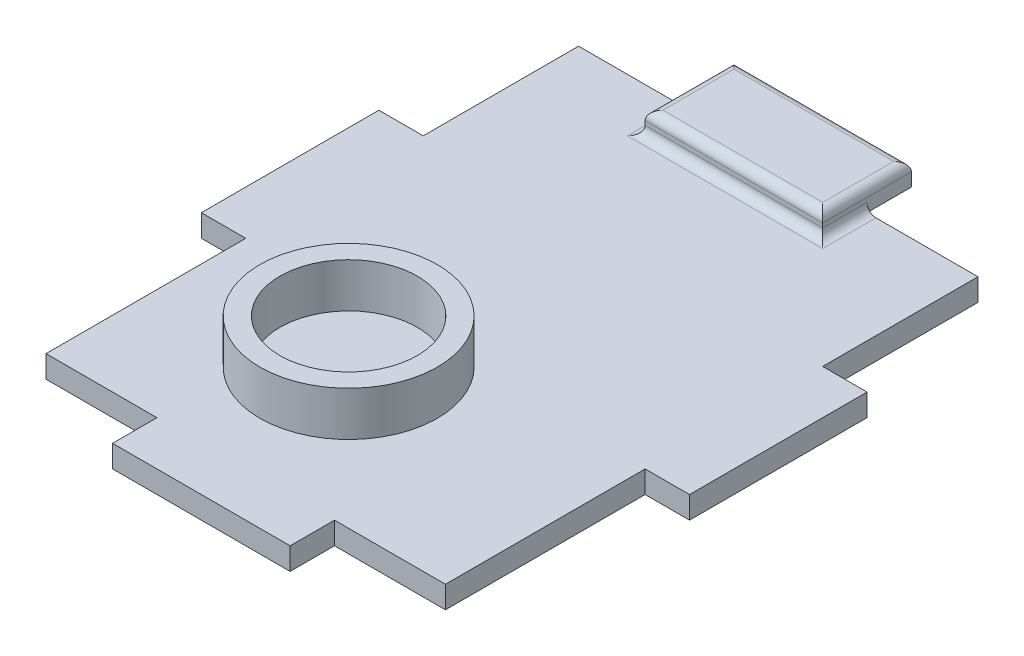
ISO-10303-21;
HEADER;
FILE_DESCRIPTION(('STEP AP214'),'2;1');
FILE_NAME('part.step','',(''),(''),'','','');
FILE_SCHEMA(('AUTOMOTIVE_DESIGN { 1 0 10303 214 1 1 1 1 }'));
ENDSEC;
DATA;
#1=APPLICATION_CONTEXT('core data for automotive mechanical design processes');
#2=APPLICATION_PROTOCOL_DEFINITION('international standard','automotive_design',2000,#1);
#3=PRODUCT_CONTEXT('',#1,'mechanical');
#4=PRODUCT('Part','Part','',(#3));
#5=PRODUCT_RELATED_PRODUCT_CATEGORY('part','',(#4));
#6=PRODUCT_DEFINITION_FORMATION('','',#4);
#7=PRODUCT_DEFINITION_CONTEXT('part definition',#1,'design');
#8=PRODUCT_DEFINITION('design','',#6,#7);
#9=PRODUCT_DEFINITION_SHAPE('','',#8);
#10=(LENGTH_UNIT() NAMED_UNIT(*) SI_UNIT(.MILLI.,.METRE.));
#11=(NAMED_UNIT(*) PLANE_ANGLE_UNIT() SI_UNIT($,.RADIAN.));
#12=(NAMED_UNIT(*) SI_UNIT($,.STERADIAN.) SOLID_ANGLE_UNIT());
#13=UNCERTAINTY_MEASURE_WITH_UNIT(LENGTH_MEASURE(1.E-05),#10,'distance_accuracy_value','');
#14=(GEOMETRIC_REPRESENTATION_CONTEXT(3) GLOBAL_UNCERTAINTY_ASSIGNED_CONTEXT((#13)) GLOBAL_UNIT_ASSIGNED_CONTEXT((#10,
#11,#12)) REPRESENTATION_CONTEXT('',''));
#15=CARTESIAN_POINT('',(0.,0.,0.));
#16=DIRECTION('',(0.,0.,1.));
#17=DIRECTION('',(1.,0.,0.));
#18=AXIS2_PLACEMENT_3D('',#15,#16,#17);
#19=CARTESIAN_POINT('',(0.,5.,0.));
#20=DIRECTION('',(0.,1.,0.));
#21=DIRECTION('',(0.,0.,1.));
#22=AXIS2_PLACEMENT_3D('',#19,#20,#21);
#23=PLANE('',#22);
#24=CARTESIAN_POINT('',(36.72,5.,-31.47));
#25=DIRECTION('',(0.,1.,0.));
#26=DIRECTION('',(0.,0.,1.));
#27=AXIS2_PLACEMENT_3D('',#24,#25,#26);
#28=CIRCLE('',#27,20.);
#29=CARTESIAN_POINT('',(36.72,5.,-11.47));
#30=VERTEX_POINT('',#29);
#31=EDGE_CURVE('E244',#30,#30,#28,.T.);
#32=ORIENTED_EDGE('',*,*,#31,.F.);
#33=EDGE_LOOP('',(#32));
#34=FACE_BOUND('',#33,.T.);
#35=DIRECTION('',(1.,0.,0.));
#36=VECTOR('',#35,1.);
#37=CARTESIAN_POINT('',(0.,5.,-108.));
#38=LINE('',#37,#36);
#39=CARTESIAN_POINT('',(67.,5.,-108.));
#40=VERTEX_POINT('',#39);
#41=CARTESIAN_POINT('',(23.,5.,-108.));
#42=VERTEX_POINT('',#41);
#43=EDGE_CURVE('E60',#40,#42,#38,.F.);
#44=ORIENTED_EDGE('',*,*,#43,.T.);
#45=DIRECTION('',(0.,0.,-1.));
#46=VECTOR('',#45,1.);
#47=CARTESIAN_POINT('',(23.,5.,0.));
#48=LINE('',#47,#46);
#49=CARTESIAN_POINT('',(23.,5.,-120.));
#50=VERTEX_POINT('',#49);
#51=EDGE_CURVE('E398',#42,#50,#48,.T.);
#52=ORIENTED_EDGE('',*,*,#51,.T.);
#53=DIRECTION('',(1.,0.,0.));
#54=VECTOR('',#53,1.);
#55=CARTESIAN_POINT('',(0.,5.,-120.));
#56=LINE('',#55,#54);
#57=CARTESIAN_POINT('',(0.,5.,-120.));
#58=VERTEX_POINT('',#57);
#59=EDGE_CURVE('E278',#58,#50,#56,.T.);
#60=ORIENTED_EDGE('',*,*,#59,.F.);
#61=DIRECTION('',(0.,0.,-1.));
#62=VECTOR('',#61,1.);
#63=CARTESIAN_POINT('',(0.,5.,0.));
#64=LINE('',#63,#62);
#65=CARTESIAN_POINT('',(0.,5.,-85.));
#66=VERTEX_POINT('',#65);
#67=EDGE_CURVE('E281',#66,#58,#64,.T.);
#68=ORIENTED_EDGE('',*,*,#67,.F.);
#69=DIRECTION('',(-1.,0.,0.));
#70=VECTOR('',#69,1.);
#71=CARTESIAN_POINT('',(1.17961196366423E-13,5.,-85.));
#72=LINE('',#71,#70);
#73=CARTESIAN_POINT('',(-9.99999999999999,5.,-85.));
#74=VERTEX_POINT('',#73);
#75=EDGE_CURVE('E286',#66,#74,#72,.T.);
#76=ORIENTED_EDGE('',*,*,#75,.T.);
#77=DIRECTION('',(0.,0.,1.));
#78=VECTOR('',#77,1.);
#79=CARTESIAN_POINT('',(-9.99999999999999,5.,0.));
#80=LINE('',#79,#78);
#81=CARTESIAN_POINT('',(-9.99999999999999,5.,-45.));
#82=VERTEX_POINT('',#81);
#83=EDGE_CURVE('E289',#74,#82,#80,.T.);
#84=ORIENTED_EDGE('',*,*,#83,.T.);
#85=DIRECTION('',(-1.,0.,0.));
#86=VECTOR('',#85,1.);
#87=CARTESIAN_POINT('',(0.,5.,-45.));
#88=LINE('',#87,#86);
#89=CARTESIAN_POINT('',(0.,5.,-45.));
#90=VERTEX_POINT('',#89);
#91=EDGE_CURVE('E291',#90,#82,#88,.T.);
#92=ORIENTED_EDGE('',*,*,#91,.F.);
#93=CARTESIAN_POINT('',(0.,5.,0.));
#94=VERTEX_POINT('',#93);
#95=EDGE_CURVE('E287',#94,#90,#64,.T.);
#96=ORIENTED_EDGE('',*,*,#95,.F.);
#97=DIRECTION('',(1.,0.,0.));
#98=VECTOR('',#97,1.);
#99=CARTESIAN_POINT('',(0.,5.,0.));
#100=LINE('',#99,#98);
#101=CARTESIAN_POINT('',(25.,5.,0.));
#102=VERTEX_POINT('',#101);
#103=EDGE_CURVE('E254',#94,#102,#100,.T.);
#104=ORIENTED_EDGE('',*,*,#103,.T.);
#105=DIRECTION('',(0.,0.,1.));
#106=VECTOR('',#105,1.);
#107=CARTESIAN_POINT('',(25.,5.,0.));
#108=LINE('',#107,#106);
#109=CARTESIAN_POINT('',(25.,5.,10.));
#110=VERTEX_POINT('',#109);
#111=EDGE_CURVE('E257',#102,#110,#108,.T.);
#112=ORIENTED_EDGE('',*,*,#111,.T.);
#113=DIRECTION('',(-1.,0.,0.));
#114=VECTOR('',#113,1.);
#115=CARTESIAN_POINT('',(0.,5.,10.));
#116=LINE('',#115,#114);
#117=CARTESIAN_POINT('',(65.,5.,10.));
#118=VERTEX_POINT('',#117);
#119=EDGE_CURVE('E261',#118,#110,#116,.T.);
#120=ORIENTED_EDGE('',*,*,#119,.F.);
#121=DIRECTION('',(0.,0.,1.));
#122=VECTOR('',#121,1.);
#123=CARTESIAN_POINT('',(65.,5.,0.));
#124=LINE('',#123,#122);
#125=CARTESIAN_POINT('',(65.,5.,0.));
#126=VERTEX_POINT('',#125);
#127=EDGE_CURVE('E264',#126,#118,#124,.T.);
#128=ORIENTED_EDGE('',*,*,#127,.F.);
#129=CARTESIAN_POINT('',(90.,5.,0.));
#130=VERTEX_POINT('',#129);
#131=EDGE_CURVE('E259',#126,#130,#100,.T.);
#132=ORIENTED_EDGE('',*,*,#131,.T.);
#133=DIRECTION('',(0.,0.,-1.));
#134=VECTOR('',#133,1.);
#135=CARTESIAN_POINT('',(90.,5.,0.));
#136=LINE('',#135,#134);
#137=CARTESIAN_POINT('',(90.,5.,-45.));
#138=VERTEX_POINT('',#137);
#139=EDGE_CURVE('E267',#130,#138,#136,.T.);
#140=ORIENTED_EDGE('',*,*,#139,.T.);
#141=DIRECTION('',(1.,0.,0.));
#142=VECTOR('',#141,1.);
#143=CARTESIAN_POINT('',(0.,5.,-45.));
#144=LINE('',#143,#142);
#145=CARTESIAN_POINT('',(100.,5.,-45.));
#146=VERTEX_POINT('',#145);
#147=EDGE_CURVE('E269',#138,#146,#144,.T.);
#148=ORIENTED_EDGE('',*,*,#147,.T.);
#149=DIRECTION('',(0.,0.,1.));
#150=VECTOR('',#149,1.);
#151=CARTESIAN_POINT('',(100.,5.,0.));
#152=LINE('',#151,#150);
#153=CARTESIAN_POINT('',(100.,5.,-85.));
#154=VERTEX_POINT('',#153);
#155=EDGE_CURVE('E272',#154,#146,#152,.T.);
#156=ORIENTED_EDGE('',*,*,#155,.F.);
#157=DIRECTION('',(1.,0.,0.));
#158=VECTOR('',#157,1.);
#159=CARTESIAN_POINT('',(1.17961196366423E-13,5.,-85.0000000000001));
#160=LINE('',#159,#158);
#161=CARTESIAN_POINT('',(90.,5.,-85.));
#162=VERTEX_POINT('',#161);
#163=EDGE_CURVE('E275',#162,#154,#160,.T.);
#164=ORIENTED_EDGE('',*,*,#163,.F.);
#165=CARTESIAN_POINT('',(90.,5.,-120.));
#166=VERTEX_POINT('',#165);
#167=EDGE_CURVE('E270',#162,#166,#136,.T.);
#168=ORIENTED_EDGE('',*,*,#167,.T.);
#169=CARTESIAN_POINT('',(67.,5.,-120.));
#170=VERTEX_POINT('',#169);
#171=EDGE_CURVE('E283',#170,#166,#56,.T.);
#172=ORIENTED_EDGE('',*,*,#171,.F.);
#173=DIRECTION('',(0.,0.,-1.));
#174=VECTOR('',#173,1.);
#175=CARTESIAN_POINT('',(67.,5.,0.));
#176=LINE('',#175,#174);
#177=EDGE_CURVE('E396',#170,#40,#176,.F.);
#178=ORIENTED_EDGE('',*,*,#177,.T.);
#179=EDGE_LOOP('',(#44,#52,#60,#68,#76,#84,#92,#96,#104,#112,#120,#128,#132,#140,#148,#156,#164,
#168,#172,#178));
#180=FACE_BOUND('',#179,.T.);
#181=ADVANCED_FACE('F35',(#34,#180),#23,.T.);
#182=CARTESIAN_POINT('',(0.,5.,0.));
#183=DIRECTION('',(0.,0.,-1.));
#184=DIRECTION('',(-1.,0.,0.));
#185=AXIS2_PLACEMENT_3D('',#182,#183,#184);
#186=PLANE('',#185);
#187=DIRECTION('',(1.,0.,0.));
#188=VECTOR('',#187,1.);
#189=CARTESIAN_POINT('',(0.,0.,0.));
#190=LINE('',#189,#188);
#191=CARTESIAN_POINT('',(0.,0.,0.));
#192=VERTEX_POINT('',#191);
#193=CARTESIAN_POINT('',(25.,0.,0.));
#194=VERTEX_POINT('',#193);
#195=EDGE_CURVE('E251',#192,#194,#190,.T.);
#196=ORIENTED_EDGE('',*,*,#195,.T.);
#197=DIRECTION('',(0.,-1.,0.));
#198=VECTOR('',#197,1.);
#199=CARTESIAN_POINT('',(25.,5.,0.));
#200=LINE('',#199,#198);
#201=EDGE_CURVE('E365',#102,#194,#200,.T.);
#202=ORIENTED_EDGE('',*,*,#201,.F.);
#203=ORIENTED_EDGE('',*,*,#103,.F.);
#204=DIRECTION('',(0.,-1.,0.));
#205=VECTOR('',#204,1.);
#206=CARTESIAN_POINT('',(0.,5.,0.));
#207=LINE('',#206,#205);
#208=EDGE_CURVE('E332',#94,#192,#207,.T.);
#209=ORIENTED_EDGE('',*,*,#208,.T.);
#210=EDGE_LOOP('',(#196,#202,#203,#209));
#211=FACE_BOUND('',#210,.T.);
#212=ADVANCED_FACE('F460',(#211),#186,.F.);
#213=CARTESIAN_POINT('',(25.,5.,0.));
#214=DIRECTION('',(1.,0.,0.));
#215=DIRECTION('',(0.,0.,-1.));
#216=AXIS2_PLACEMENT_3D('',#213,#214,#215);
#217=PLANE('',#216);
#218=DIRECTION('',(0.,0.,1.));
#219=VECTOR('',#218,1.);
#220=CARTESIAN_POINT('',(25.,0.,0.));
#221=LINE('',#220,#219);
#222=CARTESIAN_POINT('',(25.,0.,10.));
#223=VERTEX_POINT('',#222);
#224=EDGE_CURVE('E296',#194,#223,#221,.T.);
#225=ORIENTED_EDGE('',*,*,#224,.T.);
#226=DIRECTION('',(0.,-1.,0.));
#227=VECTOR('',#226,1.);
#228=CARTESIAN_POINT('',(25.,5.,10.));
#229=LINE('',#228,#227);
#230=EDGE_CURVE('E363',#110,#223,#229,.T.);
#231=ORIENTED_EDGE('',*,*,#230,.F.);
#232=ORIENTED_EDGE('',*,*,#111,.F.);
#233=ORIENTED_EDGE('',*,*,#201,.T.);
#234=EDGE_LOOP('',(#225,#231,#232,#233));
#235=FACE_BOUND('',#234,.T.);
#236=ADVANCED_FACE('F467',(#235),#217,.F.);
#237=CARTESIAN_POINT('',(0.,5.,10.));
#238=DIRECTION('',(0.,0.,1.));
#239=DIRECTION('',(1.,0.,0.));
#240=AXIS2_PLACEMENT_3D('',#237,#238,#239);
#241=PLANE('',#240);
#242=DIRECTION('',(-1.,0.,0.));
#243=VECTOR('',#242,1.);
#244=CARTESIAN_POINT('',(0.,0.,10.));
#245=LINE('',#244,#243);
#246=CARTESIAN_POINT('',(65.,0.,10.));
#247=VERTEX_POINT('',#246);
#248=EDGE_CURVE('E300',#247,#223,#245,.T.);
#249=ORIENTED_EDGE('',*,*,#248,.F.);
#250=DIRECTION('',(0.,-1.,0.));
#251=VECTOR('',#250,1.);
#252=CARTESIAN_POINT('',(65.,5.,10.));
#253=LINE('',#252,#251);
#254=EDGE_CURVE('E361',#118,#247,#253,.T.);
#255=ORIENTED_EDGE('',*,*,#254,.F.);
#256=ORIENTED_EDGE('',*,*,#119,.T.);
#257=ORIENTED_EDGE('',*,*,#230,.T.);
#258=EDGE_LOOP('',(#249,#255,#256,#257));
#259=FACE_BOUND('',#258,.T.);
#260=ADVANCED_FACE('F737',(#259),#241,.T.);
#261=CARTESIAN_POINT('',(65.,5.,0.));
#262=DIRECTION('',(1.,0.,0.));
#263=DIRECTION('',(0.,0.,-1.));
#264=AXIS2_PLACEMENT_3D('',#261,#262,#263);
#265=PLANE('',#264);
#266=DIRECTION('',(0.,0.,1.));
#267=VECTOR('',#266,1.);
#268=CARTESIAN_POINT('',(65.,0.,0.));
#269=LINE('',#268,#267);
#270=CARTESIAN_POINT('',(65.,0.,0.));
#271=VERTEX_POINT('',#270);
#272=EDGE_CURVE('E303',#271,#247,#269,.T.);
#273=ORIENTED_EDGE('',*,*,#272,.F.);
#274=DIRECTION('',(0.,-1.,0.));
#275=VECTOR('',#274,1.);
#276=CARTESIAN_POINT('',(65.,5.,0.));
#277=LINE('',#276,#275);
#278=EDGE_CURVE('E359',#126,#271,#277,.T.);
#279=ORIENTED_EDGE('',*,*,#278,.F.);
#280=ORIENTED_EDGE('',*,*,#127,.T.);
#281=ORIENTED_EDGE('',*,*,#254,.T.);
#282=EDGE_LOOP('',(#273,#279,#280,#281));
#283=FACE_BOUND('',#282,.T.);
#284=ADVANCED_FACE('F733',(#283),#265,.T.);
#285=CARTESIAN_POINT('',(90.,0.,0.));
#286=VERTEX_POINT('',#285);
#287=EDGE_CURVE('E297',#271,#286,#190,.T.);
#288=ORIENTED_EDGE('',*,*,#287,.T.);
#289=DIRECTION('',(0.,-1.,0.));
#290=VECTOR('',#289,1.);
#291=CARTESIAN_POINT('',(90.,5.,0.));
#292=LINE('',#291,#290);
#293=EDGE_CURVE('E356',#130,#286,#292,.T.);
#294=ORIENTED_EDGE('',*,*,#293,.F.);
#295=ORIENTED_EDGE('',*,*,#131,.F.);
#296=ORIENTED_EDGE('',*,*,#278,.T.);
#297=EDGE_LOOP('',(#288,#294,#295,#296));
#298=FACE_BOUND('',#297,.T.);
#299=ADVANCED_FACE('F470',(#298),#186,.F.);
#300=CARTESIAN_POINT('',(90.,5.,0.));
#301=DIRECTION('',(-1.,0.,0.));
#302=DIRECTION('',(0.,0.,1.));
#303=AXIS2_PLACEMENT_3D('',#300,#301,#302);
#304=PLANE('',#303);
#305=DIRECTION('',(0.,0.,-1.));
#306=VECTOR('',#305,1.);
#307=CARTESIAN_POINT('',(90.,0.,0.));
#308=LINE('',#307,#306);
#309=CARTESIAN_POINT('',(90.,0.,-45.));
#310=VERTEX_POINT('',#309);
#311=EDGE_CURVE('E306',#286,#310,#308,.T.);
#312=ORIENTED_EDGE('',*,*,#311,.T.);
#313=DIRECTION('',(0.,-1.,0.));
#314=VECTOR('',#313,1.);
#315=CARTESIAN_POINT('',(90.,5.,-45.));
#316=LINE('',#315,#314);
#317=EDGE_CURVE('E353',#138,#310,#316,.T.);
#318=ORIENTED_EDGE('',*,*,#317,.F.);
#319=ORIENTED_EDGE('',*,*,#139,.F.);
#320=ORIENTED_EDGE('',*,*,#293,.T.);
#321=EDGE_LOOP('',(#312,#318,#319,#320));
#322=FACE_BOUND('',#321,.T.);
#323=ADVANCED_FACE('F721',(#322),#304,.F.);
#324=CARTESIAN_POINT('',(0.,5.,-45.));
#325=DIRECTION('',(0.,0.,-1.));
#326=DIRECTION('',(-1.,0.,0.));
#327=AXIS2_PLACEMENT_3D('',#324,#325,#326);
#328=PLANE('',#327);
#329=DIRECTION('',(1.,0.,0.));
#330=VECTOR('',#329,1.);
#331=CARTESIAN_POINT('',(0.,0.,-45.));
#332=LINE('',#331,#330);
#333=CARTESIAN_POINT('',(100.,0.,-45.));
#334=VERTEX_POINT('',#333);
#335=EDGE_CURVE('E308',#310,#334,#332,.T.);
#336=ORIENTED_EDGE('',*,*,#335,.T.);
#337=DIRECTION('',(0.,-1.,0.));
#338=VECTOR('',#337,1.);
#339=CARTESIAN_POINT('',(100.,5.,-45.));
#340=LINE('',#339,#338);
#341=EDGE_CURVE('E351',#146,#334,#340,.T.);
#342=ORIENTED_EDGE('',*,*,#341,.F.);
#343=ORIENTED_EDGE('',*,*,#147,.F.);
#344=ORIENTED_EDGE('',*,*,#317,.T.);
#345=EDGE_LOOP('',(#336,#342,#343,#344));
#346=FACE_BOUND('',#345,.T.);
#347=ADVANCED_FACE('F727',(#346),#328,.F.);
#348=CARTESIAN_POINT('',(100.,5.,0.));
#349=DIRECTION('',(1.,0.,0.));
#350=DIRECTION('',(0.,0.,-1.));
#351=AXIS2_PLACEMENT_3D('',#348,#349,#350);
#352=PLANE('',#351);
#353=DIRECTION('',(0.,0.,1.));
#354=VECTOR('',#353,1.);
#355=CARTESIAN_POINT('',(100.,0.,0.));
#356=LINE('',#355,#354);
#357=CARTESIAN_POINT('',(100.,0.,-85.));
#358=VERTEX_POINT('',#357);
#359=EDGE_CURVE('E312',#358,#334,#356,.T.);
#360=ORIENTED_EDGE('',*,*,#359,.F.);
#361=DIRECTION('',(0.,-1.,0.));
#362=VECTOR('',#361,1.);
#363=CARTESIAN_POINT('',(100.,5.,-85.));
#364=LINE('',#363,#362);
#365=EDGE_CURVE('E349',#154,#358,#364,.T.);
#366=ORIENTED_EDGE('',*,*,#365,.F.);
#367=ORIENTED_EDGE('',*,*,#155,.T.);
#368=ORIENTED_EDGE('',*,*,#341,.T.);
#369=EDGE_LOOP('',(#360,#366,#367,#368));
#370=FACE_BOUND('',#369,.T.);
#371=ADVANCED_FACE('F723',(#370),#352,.T.);
#372=CARTESIAN_POINT('',(1.17961196366423E-13,5.,-85.0000000000001));
#373=DIRECTION('',(0.,0.,-1.));
#374=DIRECTION('',(-1.,0.,0.));
#375=AXIS2_PLACEMENT_3D('',#372,#373,#374);
#376=PLANE('',#375);
#377=DIRECTION('',(1.,0.,0.));
#378=VECTOR('',#377,1.);
#379=CARTESIAN_POINT('',(1.17961196366423E-13,0.,-85.0000000000001));
#380=LINE('',#379,#378);
#381=CARTESIAN_POINT('',(90.,0.,-85.));
#382=VERTEX_POINT('',#381);
#383=EDGE_CURVE('E315',#382,#358,#380,.T.);
#384=ORIENTED_EDGE('',*,*,#383,.F.);
#385=DIRECTION('',(0.,-1.,0.));
#386=VECTOR('',#385,1.);
#387=CARTESIAN_POINT('',(90.,5.,-85.));
#388=LINE('',#387,#386);
#389=EDGE_CURVE('E347',#162,#382,#388,.T.);
#390=ORIENTED_EDGE('',*,*,#389,.F.);
#391=ORIENTED_EDGE('',*,*,#163,.T.);
#392=ORIENTED_EDGE('',*,*,#365,.T.);
#393=EDGE_LOOP('',(#384,#390,#391,#392));
#394=FACE_BOUND('',#393,.T.);
#395=ADVANCED_FACE('F719',(#394),#376,.T.);
#396=CARTESIAN_POINT('',(90.,0.,-120.));
#397=VERTEX_POINT('',#396);
#398=EDGE_CURVE('E309',#382,#397,#308,.T.);
#399=ORIENTED_EDGE('',*,*,#398,.T.);
#400=DIRECTION('',(0.,-1.,0.));
#401=VECTOR('',#400,1.);
#402=CARTESIAN_POINT('',(90.,5.,-120.));
#403=LINE('',#402,#401);
#404=EDGE_CURVE('E345',#166,#397,#403,.T.);
#405=ORIENTED_EDGE('',*,*,#404,.F.);
#406=ORIENTED_EDGE('',*,*,#167,.F.);
#407=ORIENTED_EDGE('',*,*,#389,.T.);
#408=EDGE_LOOP('',(#399,#405,#406,#407));
#409=FACE_BOUND('',#408,.T.);
#410=ADVANCED_FACE('F604',(#409),#304,.F.);
#411=CARTESIAN_POINT('',(0.,5.,-120.));
#412=DIRECTION('',(0.,0.,-1.));
#413=DIRECTION('',(-1.,0.,0.));
#414=AXIS2_PLACEMENT_3D('',#411,#412,#413);
#415=PLANE('',#414);
#416=DIRECTION('',(1.,0.,0.));
#417=VECTOR('',#416,1.);
#418=CARTESIAN_POINT('',(0.,0.,-120.));
#419=LINE('',#418,#417);
#420=CARTESIAN_POINT('',(0.,0.,-120.));
#421=VERTEX_POINT('',#420);
#422=EDGE_CURVE('E318',#421,#397,#419,.T.);
#423=ORIENTED_EDGE('',*,*,#422,.F.);
#424=DIRECTION('',(0.,-1.,0.));
#425=VECTOR('',#424,1.);
#426=CARTESIAN_POINT('',(0.,5.,-120.));
#427=LINE('',#426,#425);
#428=EDGE_CURVE('E343',#58,#421,#427,.T.);
#429=ORIENTED_EDGE('',*,*,#428,.F.);
#430=ORIENTED_EDGE('',*,*,#59,.T.);
#431=CARTESIAN_POINT('',(23.,7.,-120.));
#432=DIRECTION('',(0.,0.,-1.));
#433=DIRECTION('',(-1.,0.,0.));
#434=AXIS2_PLACEMENT_3D('',#431,#432,#433);
#435=CIRCLE('',#434,2.);
#436=CARTESIAN_POINT('',(25.,7.,-120.));
#437=VERTEX_POINT('',#436);
#438=EDGE_CURVE('E44',#50,#437,#435,.F.);
#439=ORIENTED_EDGE('',*,*,#438,.T.);
#440=DIRECTION('',(0.,1.,0.));
#441=VECTOR('',#440,1.);
#442=CARTESIAN_POINT('',(25.,10.,-120.));
#443=LINE('',#442,#441);
#444=CARTESIAN_POINT('',(25.,5.,-120.));
#445=VERTEX_POINT('',#444);
#446=EDGE_CURVE('E52',#445,#437,#443,.T.);
#447=ORIENTED_EDGE('',*,*,#446,.F.);
#448=CARTESIAN_POINT('',(65.,5.,-120.));
#449=VERTEX_POINT('',#448);
#450=EDGE_CURVE('E282',#445,#449,#56,.T.);
#451=ORIENTED_EDGE('',*,*,#450,.T.);
#452=DIRECTION('',(0.,-1.,0.));
#453=VECTOR('',#452,1.);
#454=CARTESIAN_POINT('',(65.,10.,-120.));
#455=LINE('',#454,#453);
#456=CARTESIAN_POINT('',(65.,7.,-120.));
#457=VERTEX_POINT('',#456);
#458=EDGE_CURVE('E229',#457,#449,#455,.T.);
#459=ORIENTED_EDGE('',*,*,#458,.F.);
#460=CARTESIAN_POINT('',(67.,7.,-120.));
#461=DIRECTION('',(0.,0.,-1.));
#462=DIRECTION('',(-1.,0.,0.));
#463=AXIS2_PLACEMENT_3D('',#460,#461,#462);
#464=CIRCLE('',#463,2.);
#465=EDGE_CURVE('E11',#457,#170,#464,.F.);
#466=ORIENTED_EDGE('',*,*,#465,.T.);
#467=ORIENTED_EDGE('',*,*,#171,.T.);
#468=ORIENTED_EDGE('',*,*,#404,.T.);
#469=EDGE_LOOP('',(#423,#429,#430,#439,#447,#451,#459,#466,#467,#468));
#470=FACE_BOUND('',#469,.T.);
#471=ADVANCED_FACE('F599',(#470),#415,.T.);
#472=CARTESIAN_POINT('',(0.,5.,0.));
#473=DIRECTION('',(-1.,0.,0.));
#474=DIRECTION('',(0.,0.,1.));
#475=AXIS2_PLACEMENT_3D('',#472,#473,#474);
#476=PLANE('',#475);
#477=DIRECTION('',(0.,0.,-1.));
#478=VECTOR('',#477,1.);
#479=CARTESIAN_POINT('',(0.,0.,0.));
#480=LINE('',#479,#478);
#481=CARTESIAN_POINT('',(0.,0.,-85.));
#482=VERTEX_POINT('',#481);
#483=EDGE_CURVE('E321',#482,#421,#480,.T.);
#484=ORIENTED_EDGE('',*,*,#483,.F.);
#485=DIRECTION('',(0.,-1.,0.));
#486=VECTOR('',#485,1.);
#487=CARTESIAN_POINT('',(0.,5.,-85.));
#488=LINE('',#487,#486);
#489=EDGE_CURVE('E341',#66,#482,#488,.T.);
#490=ORIENTED_EDGE('',*,*,#489,.F.);
#491=ORIENTED_EDGE('',*,*,#67,.T.);
#492=ORIENTED_EDGE('',*,*,#428,.T.);
#493=EDGE_LOOP('',(#484,#490,#491,#492));
#494=FACE_BOUND('',#493,.T.);
#495=ADVANCED_FACE('F603',(#494),#476,.T.);
#496=CARTESIAN_POINT('',(1.17961196366423E-13,5.,-85.));
#497=DIRECTION('',(0.,0.,1.));
#498=DIRECTION('',(1.,0.,0.));
#499=AXIS2_PLACEMENT_3D('',#496,#497,#498);
#500=PLANE('',#499);
#501=DIRECTION('',(-1.,0.,0.));
#502=VECTOR('',#501,1.);
#503=CARTESIAN_POINT('',(1.17961196366423E-13,0.,-85.));
#504=LINE('',#503,#502);
#505=CARTESIAN_POINT('',(-9.99999999999999,0.,-85.));
#506=VERTEX_POINT('',#505);
#507=EDGE_CURVE('E324',#482,#506,#504,.T.);
#508=ORIENTED_EDGE('',*,*,#507,.T.);
#509=DIRECTION('',(0.,-1.,0.));
#510=VECTOR('',#509,1.);
#511=CARTESIAN_POINT('',(-9.99999999999999,5.,-85.));
#512=LINE('',#511,#510);
#513=EDGE_CURVE('E338',#74,#506,#512,.T.);
#514=ORIENTED_EDGE('',*,*,#513,.F.);
#515=ORIENTED_EDGE('',*,*,#75,.F.);
#516=ORIENTED_EDGE('',*,*,#489,.T.);
#517=EDGE_LOOP('',(#508,#514,#515,#516));
#518=FACE_BOUND('',#517,.T.);
#519=ADVANCED_FACE('F619',(#518),#500,.F.);
#520=CARTESIAN_POINT('',(-9.99999999999999,5.,0.));
#521=DIRECTION('',(1.,0.,0.));
#522=DIRECTION('',(0.,0.,-1.));
#523=AXIS2_PLACEMENT_3D('',#520,#521,#522);
#524=PLANE('',#523);
#525=DIRECTION('',(0.,0.,1.));
#526=VECTOR('',#525,1.);
#527=CARTESIAN_POINT('',(-9.99999999999999,0.,0.));
#528=LINE('',#527,#526);
#529=CARTESIAN_POINT('',(-9.99999999999999,0.,-45.));
#530=VERTEX_POINT('',#529);
#531=EDGE_CURVE('E326',#506,#530,#528,.T.);
#532=ORIENTED_EDGE('',*,*,#531,.T.);
#533=DIRECTION('',(0.,-1.,0.));
#534=VECTOR('',#533,1.);
#535=CARTESIAN_POINT('',(-9.99999999999999,5.,-45.));
#536=LINE('',#535,#534);
#537=EDGE_CURVE('E336',#82,#530,#536,.T.);
#538=ORIENTED_EDGE('',*,*,#537,.F.);
#539=ORIENTED_EDGE('',*,*,#83,.F.);
#540=ORIENTED_EDGE('',*,*,#513,.T.);
#541=EDGE_LOOP('',(#532,#538,#539,#540));
#542=FACE_BOUND('',#541,.T.);
#543=ADVANCED_FACE('F627',(#542),#524,.F.);
#544=CARTESIAN_POINT('',(0.,5.,-45.));
#545=DIRECTION('',(0.,0.,1.));
#546=DIRECTION('',(1.,0.,0.));
#547=AXIS2_PLACEMENT_3D('',#544,#545,#546);
#548=PLANE('',#547);
#549=DIRECTION('',(-1.,0.,0.));
#550=VECTOR('',#549,1.);
#551=CARTESIAN_POINT('',(0.,0.,-45.));
#552=LINE('',#551,#550);
#553=CARTESIAN_POINT('',(0.,0.,-45.));
#554=VERTEX_POINT('',#553);
#555=EDGE_CURVE('E329',#554,#530,#552,.T.);
#556=ORIENTED_EDGE('',*,*,#555,.F.);
#557=DIRECTION('',(0.,-1.,0.));
#558=VECTOR('',#557,1.);
#559=CARTESIAN_POINT('',(0.,5.,-45.));
#560=LINE('',#559,#558);
#561=EDGE_CURVE('E334',#90,#554,#560,.T.);
#562=ORIENTED_EDGE('',*,*,#561,.F.);
#563=ORIENTED_EDGE('',*,*,#91,.T.);
#564=ORIENTED_EDGE('',*,*,#537,.T.);
#565=EDGE_LOOP('',(#556,#562,#563,#564));
#566=FACE_BOUND('',#565,.T.);
#567=ADVANCED_FACE('F635',(#566),#548,.T.);
#568=EDGE_CURVE('E258',#192,#554,#480,.T.);
#569=ORIENTED_EDGE('',*,*,#568,.F.);
#570=ORIENTED_EDGE('',*,*,#208,.F.);
#571=ORIENTED_EDGE('',*,*,#95,.T.);
#572=ORIENTED_EDGE('',*,*,#561,.T.);
#573=EDGE_LOOP('',(#569,#570,#571,#572));
#574=FACE_BOUND('',#573,.T.);
#575=ADVANCED_FACE('F497',(#574),#476,.T.);
#576=CARTESIAN_POINT('',(0.,0.,0.));
#577=DIRECTION('',(0.,1.,0.));
#578=DIRECTION('',(0.,0.,1.));
#579=AXIS2_PLACEMENT_3D('',#576,#577,#578);
#580=PLANE('',#579);
#581=ORIENTED_EDGE('',*,*,#195,.F.);
#582=ORIENTED_EDGE('',*,*,#568,.T.);
#583=ORIENTED_EDGE('',*,*,#555,.T.);
#584=ORIENTED_EDGE('',*,*,#531,.F.);
#585=ORIENTED_EDGE('',*,*,#507,.F.);
#586=ORIENTED_EDGE('',*,*,#483,.T.);
#587=ORIENTED_EDGE('',*,*,#422,.T.);
#588=ORIENTED_EDGE('',*,*,#398,.F.);
#589=ORIENTED_EDGE('',*,*,#383,.T.);
#590=ORIENTED_EDGE('',*,*,#359,.T.);
#591=ORIENTED_EDGE('',*,*,#335,.F.);
#592=ORIENTED_EDGE('',*,*,#311,.F.);
#593=ORIENTED_EDGE('',*,*,#287,.F.);
#594=ORIENTED_EDGE('',*,*,#272,.T.);
#595=ORIENTED_EDGE('',*,*,#248,.T.);
#596=ORIENTED_EDGE('',*,*,#224,.F.);
#597=EDGE_LOOP('',(#581,#582,#583,#584,#585,#586,#587,#588,#589,#590,#591,#592,#593,#594,#595,#596));
#598=FACE_BOUND('',#597,.T.);
#599=ADVANCED_FACE('F489',(#598),#580,.F.);
#600=CARTESIAN_POINT('',(36.72,15.,-31.47));
#601=DIRECTION('',(0.,-1.,0.));
#602=DIRECTION('',(0.,0.,-1.));
#603=AXIS2_PLACEMENT_3D('',#600,#601,#602);
#604=CYLINDRICAL_SURFACE('',#603,15.5);
#605=CARTESIAN_POINT('',(36.72,15.,-31.47));
#606=DIRECTION('',(0.,1.,0.));
#607=DIRECTION('',(0.,0.,1.));
#608=AXIS2_PLACEMENT_3D('',#605,#606,#607);
#609=CIRCLE('',#608,15.5);
#610=CARTESIAN_POINT('',(36.72,15.,-15.97));
#611=VERTEX_POINT('',#610);
#612=EDGE_CURVE('E245',#611,#611,#609,.T.);
#613=ORIENTED_EDGE('',*,*,#612,.T.);
#614=EDGE_LOOP('',(#613));
#615=FACE_BOUND('',#614,.T.);
#616=CARTESIAN_POINT('',(36.72,5.,-31.47));
#617=DIRECTION('',(0.,1.,0.));
#618=DIRECTION('',(0.,0.,1.));
#619=AXIS2_PLACEMENT_3D('',#616,#617,#618);
#620=CIRCLE('',#619,15.5);
#621=CARTESIAN_POINT('',(36.72,5.,-15.97));
#622=VERTEX_POINT('',#621);
#623=EDGE_CURVE('E368',#622,#622,#620,.F.);
#624=ORIENTED_EDGE('',*,*,#623,.T.);
#625=EDGE_LOOP('',(#624));
#626=FACE_BOUND('',#625,.T.);
#627=ADVANCED_FACE('F487',(#615,#626),#604,.F.);
#628=CARTESIAN_POINT('',(36.72,15.,-31.47));
#629=DIRECTION('',(0.,-1.,0.));
#630=DIRECTION('',(0.,0.,-1.));
#631=AXIS2_PLACEMENT_3D('',#628,#629,#630);
#632=CYLINDRICAL_SURFACE('',#631,20.);
#633=CARTESIAN_POINT('',(36.72,15.,-31.47));
#634=DIRECTION('',(0.,1.,0.));
#635=DIRECTION('',(0.,0.,1.));
#636=AXIS2_PLACEMENT_3D('',#633,#634,#635);
#637=CIRCLE('',#636,20.);
#638=CARTESIAN_POINT('',(36.72,15.,-11.47));
#639=VERTEX_POINT('',#638);
#640=EDGE_CURVE('E248',#639,#639,#637,.T.);
#641=ORIENTED_EDGE('',*,*,#640,.F.);
#642=EDGE_LOOP('',(#641));
#643=FACE_BOUND('',#642,.T.);
#644=ORIENTED_EDGE('',*,*,#31,.T.);
#645=EDGE_LOOP('',(#644));
#646=FACE_BOUND('',#645,.T.);
#647=ADVANCED_FACE('F482',(#643,#646),#632,.T.);
#648=CARTESIAN_POINT('',(0.,15.,0.));
#649=DIRECTION('',(0.,1.,0.));
#650=DIRECTION('',(0.,0.,1.));
#651=AXIS2_PLACEMENT_3D('',#648,#649,#650);
#652=PLANE('',#651);
#653=ORIENTED_EDGE('',*,*,#612,.F.);
#654=EDGE_LOOP('',(#653));
#655=FACE_BOUND('',#654,.T.);
#656=ORIENTED_EDGE('',*,*,#640,.T.);
#657=EDGE_LOOP('',(#656));
#658=FACE_BOUND('',#657,.T.);
#659=ADVANCED_FACE('F475',(#655,#658),#652,.T.);
#660=ORIENTED_EDGE('',*,*,#623,.F.);
#661=EDGE_LOOP('',(#660));
#662=FACE_BOUND('',#661,.T.);
#663=ADVANCED_FACE('F463',(#662),#23,.T.);
#664=CARTESIAN_POINT('',(25.,10.,-130.));
#665=DIRECTION('',(1.,0.,0.));
#666=DIRECTION('',(0.,0.,-1.));
#667=AXIS2_PLACEMENT_3D('',#664,#665,#666);
#668=PLANE('',#667);
#669=DIRECTION('',(0.,-1.,0.));
#670=VECTOR('',#669,1.);
#671=CARTESIAN_POINT('',(25.,10.,-110.));
#672=LINE('',#671,#670);
#673=CARTESIAN_POINT('',(25.,8.,-110.));
#674=VERTEX_POINT('',#673);
#675=CARTESIAN_POINT('',(25.,7.,-110.));
#676=VERTEX_POINT('',#675);
#677=EDGE_CURVE('E241',#674,#676,#672,.T.);
#678=ORIENTED_EDGE('',*,*,#677,.F.);
#679=DIRECTION('',(0.,0.,1.));
#680=VECTOR('',#679,1.);
#681=CARTESIAN_POINT('',(25.,8.,-130.));
#682=LINE('',#681,#680);
#683=CARTESIAN_POINT('',(25.,8.,-130.));
#684=VERTEX_POINT('',#683);
#685=EDGE_CURVE('E393',#674,#684,#682,.F.);
#686=ORIENTED_EDGE('',*,*,#685,.T.);
#687=DIRECTION('',(0.,-1.,0.));
#688=VECTOR('',#687,1.);
#689=CARTESIAN_POINT('',(25.,10.,-130.));
#690=LINE('',#689,#688);
#691=CARTESIAN_POINT('',(25.,5.,-130.));
#692=VERTEX_POINT('',#691);
#693=EDGE_CURVE('E223',#684,#692,#690,.T.);
#694=ORIENTED_EDGE('',*,*,#693,.T.);
#695=DIRECTION('',(0.,0.,1.));
#696=VECTOR('',#695,1.);
#697=CARTESIAN_POINT('',(25.,5.,-130.));
#698=LINE('',#697,#696);
#699=EDGE_CURVE('E232',#692,#445,#698,.T.);
#700=ORIENTED_EDGE('',*,*,#699,.T.);
#701=ORIENTED_EDGE('',*,*,#446,.T.);
#702=DIRECTION('',(0.,0.,-1.));
#703=VECTOR('',#702,1.);
#704=CARTESIAN_POINT('',(25.,7.,-130.));
#705=LINE('',#704,#703);
#706=EDGE_CURVE('E390',#437,#676,#705,.F.);
#707=ORIENTED_EDGE('',*,*,#706,.T.);
#708=EDGE_LOOP('',(#678,#686,#694,#700,#701,#707));
#709=FACE_BOUND('',#708,.T.);
#710=ADVANCED_FACE('F448',(#709),#668,.F.);
#711=CARTESIAN_POINT('',(65.,10.,-110.));
#712=DIRECTION('',(0.,0.,-1.));
#713=DIRECTION('',(-1.,0.,0.));
#714=AXIS2_PLACEMENT_3D('',#711,#712,#713);
#715=PLANE('',#714);
#716=DIRECTION('',(0.,-1.,0.));
#717=VECTOR('',#716,1.);
#718=CARTESIAN_POINT('',(65.,10.,-110.));
#719=LINE('',#718,#717);
#720=CARTESIAN_POINT('',(65.,8.,-110.));
#721=VERTEX_POINT('',#720);
#722=CARTESIAN_POINT('',(65.,7.,-110.));
#723=VERTEX_POINT('',#722);
#724=EDGE_CURVE('E222',#721,#723,#719,.T.);
#725=ORIENTED_EDGE('',*,*,#724,.F.);
#726=DIRECTION('',(1.,0.,0.));
#727=VECTOR('',#726,1.);
#728=CARTESIAN_POINT('',(65.,8.,-110.));
#729=LINE('',#728,#727);
#730=EDGE_CURVE('E388',#721,#674,#729,.F.);
#731=ORIENTED_EDGE('',*,*,#730,.T.);
#732=ORIENTED_EDGE('',*,*,#677,.T.);
#733=DIRECTION('',(1.,0.,0.));
#734=VECTOR('',#733,1.);
#735=CARTESIAN_POINT('',(65.,7.,-110.));
#736=LINE('',#735,#734);
#737=EDGE_CURVE('E386',#676,#723,#736,.T.);
#738=ORIENTED_EDGE('',*,*,#737,.T.);
#739=EDGE_LOOP('',(#725,#731,#732,#738));
#740=FACE_BOUND('',#739,.T.);
#741=ADVANCED_FACE('F428',(#740),#715,.F.);
#742=CARTESIAN_POINT('',(65.,10.,-130.));
#743=DIRECTION('',(-1.,0.,0.));
#744=DIRECTION('',(0.,0.,1.));
#745=AXIS2_PLACEMENT_3D('',#742,#743,#744);
#746=PLANE('',#745);
#747=DIRECTION('',(0.,-1.,0.));
#748=VECTOR('',#747,1.);
#749=CARTESIAN_POINT('',(65.,10.,-130.));
#750=LINE('',#749,#748);
#751=CARTESIAN_POINT('',(65.,8.,-130.));
#752=VERTEX_POINT('',#751);
#753=CARTESIAN_POINT('',(65.,5.,-130.));
#754=VERTEX_POINT('',#753);
#755=EDGE_CURVE('E212',#752,#754,#750,.T.);
#756=ORIENTED_EDGE('',*,*,#755,.F.);
#757=DIRECTION('',(0.,0.,-1.));
#758=VECTOR('',#757,1.);
#759=CARTESIAN_POINT('',(65.,8.,-130.));
#760=LINE('',#759,#758);
#761=EDGE_CURVE('E384',#752,#721,#760,.F.);
#762=ORIENTED_EDGE('',*,*,#761,.T.);
#763=ORIENTED_EDGE('',*,*,#724,.T.);
#764=DIRECTION('',(0.,0.,-1.));
#765=VECTOR('',#764,1.);
#766=CARTESIAN_POINT('',(65.,7.,-130.));
#767=LINE('',#766,#765);
#768=EDGE_CURVE('E382',#723,#457,#767,.T.);
#769=ORIENTED_EDGE('',*,*,#768,.T.);
#770=ORIENTED_EDGE('',*,*,#458,.T.);
#771=DIRECTION('',(0.,0.,-1.));
#772=VECTOR('',#771,1.);
#773=CARTESIAN_POINT('',(65.,5.,-130.));
#774=LINE('',#773,#772);
#775=EDGE_CURVE('E226',#449,#754,#774,.T.);
#776=ORIENTED_EDGE('',*,*,#775,.T.);
#777=EDGE_LOOP('',(#756,#762,#763,#769,#770,#776));
#778=FACE_BOUND('',#777,.T.);
#779=ADVANCED_FACE('F227',(#778),#746,.F.);
#780=CARTESIAN_POINT('',(65.,10.,-130.));
#781=DIRECTION('',(0.,0.,1.));
#782=DIRECTION('',(1.,0.,0.));
#783=AXIS2_PLACEMENT_3D('',#780,#781,#782);
#784=PLANE('',#783);
#785=ORIENTED_EDGE('',*,*,#693,.F.);
#786=DIRECTION('',(-1.,0.,0.));
#787=VECTOR('',#786,1.);
#788=CARTESIAN_POINT('',(65.,8.,-130.));
#789=LINE('',#788,#787);
#790=EDGE_CURVE('E220',#684,#752,#789,.F.);
#791=ORIENTED_EDGE('',*,*,#790,.T.);
#792=ORIENTED_EDGE('',*,*,#755,.T.);
#793=DIRECTION('',(-1.,0.,0.));
#794=VECTOR('',#793,1.);
#795=CARTESIAN_POINT('',(65.,5.,-130.));
#796=LINE('',#795,#794);
#797=EDGE_CURVE('E217',#754,#692,#796,.T.);
#798=ORIENTED_EDGE('',*,*,#797,.T.);
#799=EDGE_LOOP('',(#785,#791,#792,#798));
#800=FACE_BOUND('',#799,.T.);
#801=ADVANCED_FACE('F215',(#800),#784,.F.);
#802=CARTESIAN_POINT('',(0.,10.,0.));
#803=DIRECTION('',(0.,-1.,0.));
#804=DIRECTION('',(0.,0.,-1.));
#805=AXIS2_PLACEMENT_3D('',#802,#803,#804);
#806=PLANE('',#805);
#807=DIRECTION('',(0.,0.,-1.));
#808=VECTOR('',#807,1.);
#809=CARTESIAN_POINT('',(63.,10.,0.));
#810=LINE('',#809,#808);
#811=CARTESIAN_POINT('',(63.,10.,-112.));
#812=VERTEX_POINT('',#811);
#813=CARTESIAN_POINT('',(63.,10.,-128.));
#814=VERTEX_POINT('',#813);
#815=EDGE_CURVE('E375',#812,#814,#810,.T.);
#816=ORIENTED_EDGE('',*,*,#815,.T.);
#817=DIRECTION('',(-1.,0.,0.));
#818=VECTOR('',#817,1.);
#819=CARTESIAN_POINT('',(0.,10.,-128.));
#820=LINE('',#819,#818);
#821=CARTESIAN_POINT('',(27.,10.,-128.));
#822=VERTEX_POINT('',#821);
#823=EDGE_CURVE('E377',#814,#822,#820,.T.);
#824=ORIENTED_EDGE('',*,*,#823,.T.);
#825=DIRECTION('',(0.,0.,1.));
#826=VECTOR('',#825,1.);
#827=CARTESIAN_POINT('',(27.,10.,0.));
#828=LINE('',#827,#826);
#829=CARTESIAN_POINT('',(27.,10.,-112.));
#830=VERTEX_POINT('',#829);
#831=EDGE_CURVE('E371',#822,#830,#828,.T.);
#832=ORIENTED_EDGE('',*,*,#831,.T.);
#833=DIRECTION('',(1.,0.,0.));
#834=VECTOR('',#833,1.);
#835=CARTESIAN_POINT('',(0.,10.,-112.));
#836=LINE('',#835,#834);
#837=EDGE_CURVE('E373',#830,#812,#836,.T.);
#838=ORIENTED_EDGE('',*,*,#837,.T.);
#839=EDGE_LOOP('',(#816,#824,#832,#838));
#840=FACE_BOUND('',#839,.T.);
#841=ADVANCED_FACE('F442',(#840),#806,.F.);
#842=CARTESIAN_POINT('',(0.,5.,0.));
#843=DIRECTION('',(0.,-1.,0.));
#844=DIRECTION('',(0.,0.,-1.));
#845=AXIS2_PLACEMENT_3D('',#842,#843,#844);
#846=PLANE('',#845);
#847=ORIENTED_EDGE('',*,*,#775,.F.);
#848=ORIENTED_EDGE('',*,*,#450,.F.);
#849=ORIENTED_EDGE('',*,*,#699,.F.);
#850=ORIENTED_EDGE('',*,*,#797,.F.);
#851=EDGE_LOOP('',(#847,#848,#849,#850));
#852=FACE_BOUND('',#851,.T.);
#853=ADVANCED_FACE('F234',(#852),#846,.T.);
#854=CARTESIAN_POINT('',(0.,8.,-112.));
#855=DIRECTION('',(1.,0.,0.));
#856=DIRECTION('',(0.,0.,-1.));
#857=AXIS2_PLACEMENT_3D('',#854,#855,#856);
#858=CYLINDRICAL_SURFACE('',#857,2.);
#859=CARTESIAN_POINT('',(27.,8.,-112.));
#860=DIRECTION('',(0.707106781186548,0.,0.707106781186547));
#861=DIRECTION('',(-0.707106781186547,0.,0.707106781186548));
#862=AXIS2_PLACEMENT_3D('',#859,#860,#861);
#863=ELLIPSE('',#862,2.82842712474619,2.);
#864=EDGE_CURVE('E405',#674,#830,#863,.F.);
#865=ORIENTED_EDGE('',*,*,#864,.F.);
#866=ORIENTED_EDGE('',*,*,#730,.F.);
#867=CARTESIAN_POINT('',(63.,8.,-112.));
#868=DIRECTION('',(0.707106781186547,0.,-0.707106781186548));
#869=DIRECTION('',(0.707106781186548,0.,0.707106781186547));
#870=AXIS2_PLACEMENT_3D('',#867,#868,#869);
#871=ELLIPSE('',#870,2.82842712474619,2.);
#872=EDGE_CURVE('E408',#812,#721,#871,.T.);
#873=ORIENTED_EDGE('',*,*,#872,.F.);
#874=ORIENTED_EDGE('',*,*,#837,.F.);
#875=EDGE_LOOP('',(#865,#866,#873,#874));
#876=FACE_BOUND('',#875,.T.);
#877=ADVANCED_FACE('F433',(#876),#858,.T.);
#878=CARTESIAN_POINT('',(63.,8.,0.));
#879=DIRECTION('',(0.,0.,-1.));
#880=DIRECTION('',(-1.,0.,0.));
#881=AXIS2_PLACEMENT_3D('',#878,#879,#880);
#882=CYLINDRICAL_SURFACE('',#881,2.);
#883=ORIENTED_EDGE('',*,*,#872,.T.);
#884=ORIENTED_EDGE('',*,*,#761,.F.);
#885=CARTESIAN_POINT('',(63.,8.,-128.));
#886=DIRECTION('',(-0.707106781186547,0.,-0.707106781186547));
#887=DIRECTION('',(0.707106781186547,0.,-0.707106781186547));
#888=AXIS2_PLACEMENT_3D('',#885,#886,#887);
#889=ELLIPSE('',#888,2.82842712474619,2.);
#890=EDGE_CURVE('E403',#814,#752,#889,.T.);
#891=ORIENTED_EDGE('',*,*,#890,.F.);
#892=ORIENTED_EDGE('',*,*,#815,.F.);
#893=EDGE_LOOP('',(#883,#884,#891,#892));
#894=FACE_BOUND('',#893,.T.);
#895=ADVANCED_FACE('F438',(#894),#882,.T.);
#896=CARTESIAN_POINT('',(27.,8.,0.));
#897=DIRECTION('',(0.,0.,1.));
#898=DIRECTION('',(1.,0.,0.));
#899=AXIS2_PLACEMENT_3D('',#896,#897,#898);
#900=CYLINDRICAL_SURFACE('',#899,2.);
#901=ORIENTED_EDGE('',*,*,#864,.T.);
#902=ORIENTED_EDGE('',*,*,#831,.F.);
#903=CARTESIAN_POINT('',(27.,8.,-128.));
#904=DIRECTION('',(-0.707106781186547,0.,0.707106781186547));
#905=DIRECTION('',(0.707106781186547,0.,0.707106781186547));
#906=AXIS2_PLACEMENT_3D('',#903,#904,#905);
#907=ELLIPSE('',#906,2.82842712474619,2.);
#908=EDGE_CURVE('E401',#684,#822,#907,.F.);
#909=ORIENTED_EDGE('',*,*,#908,.F.);
#910=ORIENTED_EDGE('',*,*,#685,.F.);
#911=EDGE_LOOP('',(#901,#902,#909,#910));
#912=FACE_BOUND('',#911,.T.);
#913=ADVANCED_FACE('F445',(#912),#900,.T.);
#914=CARTESIAN_POINT('',(0.,8.,-128.));
#915=DIRECTION('',(-1.,0.,0.));
#916=DIRECTION('',(0.,0.,1.));
#917=AXIS2_PLACEMENT_3D('',#914,#915,#916);
#918=CYLINDRICAL_SURFACE('',#917,2.);
#919=ORIENTED_EDGE('',*,*,#890,.T.);
#920=ORIENTED_EDGE('',*,*,#790,.F.);
#921=ORIENTED_EDGE('',*,*,#908,.T.);
#922=ORIENTED_EDGE('',*,*,#823,.F.);
#923=EDGE_LOOP('',(#919,#920,#921,#922));
#924=FACE_BOUND('',#923,.T.);
#925=ADVANCED_FACE('F450',(#924),#918,.T.);
#926=CARTESIAN_POINT('',(67.,7.,-130.));
#927=DIRECTION('',(0.,0.,-1.));
#928=DIRECTION('',(-1.,0.,0.));
#929=AXIS2_PLACEMENT_3D('',#926,#927,#928);
#930=CYLINDRICAL_SURFACE('',#929,2.);
#931=ORIENTED_EDGE('',*,*,#465,.F.);
#932=ORIENTED_EDGE('',*,*,#768,.F.);
#933=CARTESIAN_POINT('',(67.,7.,-108.));
#934=DIRECTION('',(0.707106781186547,0.,-0.707106781186548));
#935=DIRECTION('',(0.707106781186548,0.,0.707106781186547));
#936=AXIS2_PLACEMENT_3D('',#933,#934,#935);
#937=ELLIPSE('',#936,2.82842712474619,2.);
#938=EDGE_CURVE('E39',#40,#723,#937,.T.);
#939=ORIENTED_EDGE('',*,*,#938,.F.);
#940=ORIENTED_EDGE('',*,*,#177,.F.);
#941=EDGE_LOOP('',(#931,#932,#939,#940));
#942=FACE_BOUND('',#941,.T.);
#943=ADVANCED_FACE('F37',(#942),#930,.F.);
#944=CARTESIAN_POINT('',(65.,7.,-108.));
#945=DIRECTION('',(1.,0.,0.));
#946=DIRECTION('',(0.,0.,-1.));
#947=AXIS2_PLACEMENT_3D('',#944,#945,#946);
#948=CYLINDRICAL_SURFACE('',#947,2.);
#949=ORIENTED_EDGE('',*,*,#938,.T.);
#950=ORIENTED_EDGE('',*,*,#737,.F.);
#951=CARTESIAN_POINT('',(23.,7.,-108.));
#952=DIRECTION('',(0.707106781186548,0.,0.707106781186547));
#953=DIRECTION('',(0.707106781186547,0.,-0.707106781186548));
#954=AXIS2_PLACEMENT_3D('',#951,#952,#953);
#955=ELLIPSE('',#954,2.82842712474619,2.);
#956=EDGE_CURVE('E410',#42,#676,#955,.T.);
#957=ORIENTED_EDGE('',*,*,#956,.F.);
#958=ORIENTED_EDGE('',*,*,#43,.F.);
#959=EDGE_LOOP('',(#949,#950,#957,#958));
#960=FACE_BOUND('',#959,.T.);
#961=ADVANCED_FACE('F419',(#960),#948,.F.);
#962=CARTESIAN_POINT('',(23.,7.,0.));
#963=DIRECTION('',(0.,0.,-1.));
#964=DIRECTION('',(-1.,0.,0.));
#965=AXIS2_PLACEMENT_3D('',#962,#963,#964);
#966=CYLINDRICAL_SURFACE('',#965,2.);
#967=ORIENTED_EDGE('',*,*,#956,.T.);
#968=ORIENTED_EDGE('',*,*,#706,.F.);
#969=ORIENTED_EDGE('',*,*,#438,.F.);
#970=ORIENTED_EDGE('',*,*,#51,.F.);
#971=EDGE_LOOP('',(#967,#968,#969,#970));
#972=FACE_BOUND('',#971,.T.);
#973=ADVANCED_FACE('F552',(#972),#966,.F.);
#974=CLOSED_SHELL('',(#181,#212,#236,#260,#284,#299,#323,#347,#371,#395,#410,#471,#495,#519,
#543,#567,#575,#599,#627,#647,#659,#663,#710,#741,#779,#801,#841,#853,#877,#895,#913,#925,#943,
#961,#973));
#975=MANIFOLD_SOLID_BREP('B2',#974);
#976=ADVANCED_BREP_SHAPE_REPRESENTATION('',(#18,#975),#14);
#977=SHAPE_DEFINITION_REPRESENTATION(#9,#976);
ENDSEC;
END-ISO-10303-21;
